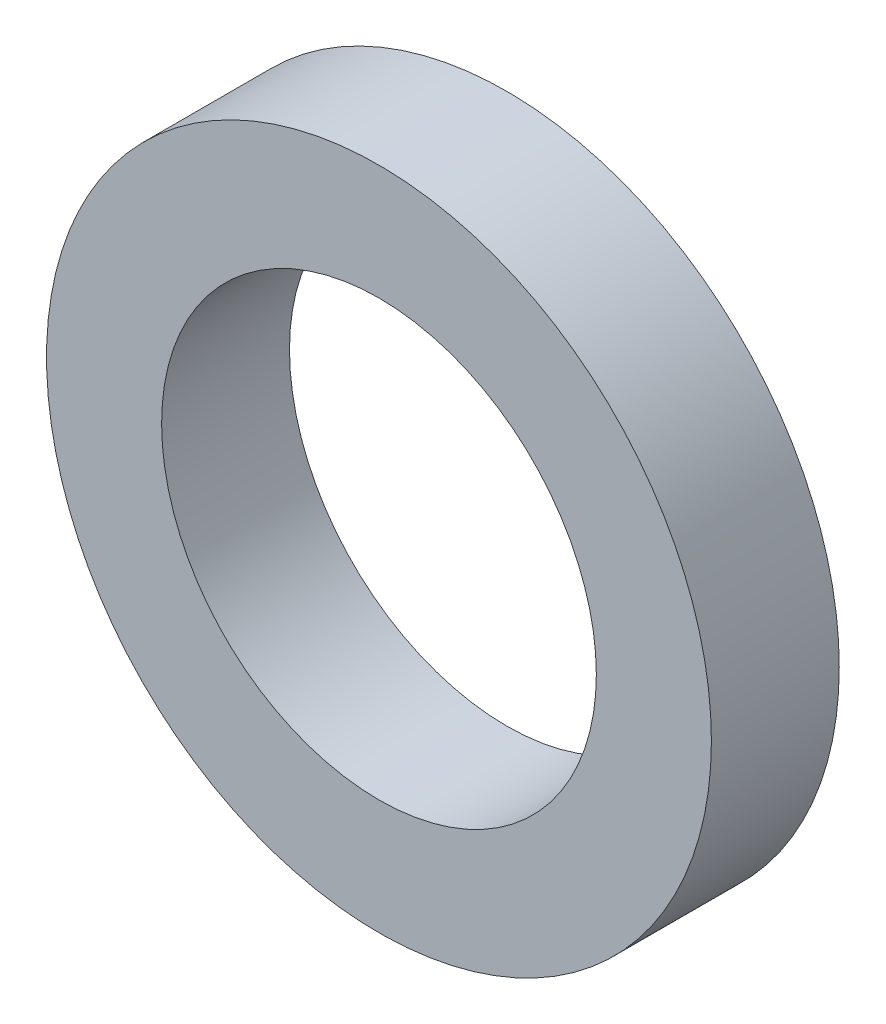
ISO-10303-21;
HEADER;
FILE_DESCRIPTION(('STEP AP214'),'2;1');
FILE_NAME('part.step','',(''),(''),'','','');
FILE_SCHEMA(('AUTOMOTIVE_DESIGN { 1 0 10303 214 1 1 1 1 }'));
ENDSEC;
DATA;
#1=APPLICATION_CONTEXT('core data for automotive mechanical design processes');
#2=APPLICATION_PROTOCOL_DEFINITION('international standard','automotive_design',2000,#1);
#3=PRODUCT_CONTEXT('',#1,'mechanical');
#4=PRODUCT('Part','Part','',(#3));
#5=PRODUCT_RELATED_PRODUCT_CATEGORY('part','',(#4));
#6=PRODUCT_DEFINITION_FORMATION('','',#4);
#7=PRODUCT_DEFINITION_CONTEXT('part definition',#1,'design');
#8=PRODUCT_DEFINITION('design','',#6,#7);
#9=PRODUCT_DEFINITION_SHAPE('','',#8);
#10=(LENGTH_UNIT() NAMED_UNIT(*) SI_UNIT(.MILLI.,.METRE.));
#11=(NAMED_UNIT(*) PLANE_ANGLE_UNIT() SI_UNIT($,.RADIAN.));
#12=(NAMED_UNIT(*) SI_UNIT($,.STERADIAN.) SOLID_ANGLE_UNIT());
#13=UNCERTAINTY_MEASURE_WITH_UNIT(LENGTH_MEASURE(1.E-05),#10,'distance_accuracy_value','');
#14=(GEOMETRIC_REPRESENTATION_CONTEXT(3) GLOBAL_UNCERTAINTY_ASSIGNED_CONTEXT((#13)) GLOBAL_UNIT_ASSIGNED_CONTEXT((#10,
#11,#12)) REPRESENTATION_CONTEXT('',''));
#15=CARTESIAN_POINT('',(0.,0.,0.));
#16=DIRECTION('',(0.,0.,1.));
#17=DIRECTION('',(1.,0.,0.));
#18=AXIS2_PLACEMENT_3D('',#15,#16,#17);
#19=CARTESIAN_POINT('',(0.,0.,-10.));
#20=DIRECTION('',(0.,0.,1.));
#21=DIRECTION('',(1.,0.,0.));
#22=AXIS2_PLACEMENT_3D('',#19,#20,#21);
#23=PLANE('',#22);
#24=CARTESIAN_POINT('',(0.,0.,-10.));
#25=DIRECTION('',(0.,0.,1.));
#26=DIRECTION('',(1.,0.,0.));
#27=AXIS2_PLACEMENT_3D('',#24,#25,#26);
#28=CIRCLE('',#27,13.);
#29=CARTESIAN_POINT('',(13.,0.,-10.));
#30=VERTEX_POINT('',#29);
#31=EDGE_CURVE('E10',#30,#30,#28,.T.);
#32=ORIENTED_EDGE('',*,*,#31,.T.);
#33=EDGE_LOOP('',(#32));
#34=FACE_BOUND('',#33,.T.);
#35=CARTESIAN_POINT('',(0.,0.,-10.));
#36=DIRECTION('',(0.,0.,1.));
#37=DIRECTION('',(1.,0.,0.));
#38=AXIS2_PLACEMENT_3D('',#35,#36,#37);
#39=CIRCLE('',#38,8.5);
#40=CARTESIAN_POINT('',(8.5,0.,-10.));
#41=VERTEX_POINT('',#40);
#42=EDGE_CURVE('E46',#41,#41,#39,.T.);
#43=ORIENTED_EDGE('',*,*,#42,.F.);
#44=EDGE_LOOP('',(#43));
#45=FACE_BOUND('',#44,.T.);
#46=ADVANCED_FACE('F32',(#34,#45),#23,.T.);
#47=CARTESIAN_POINT('',(0.,0.,-15.));
#48=DIRECTION('',(0.,0.,1.));
#49=DIRECTION('',(1.,0.,0.));
#50=AXIS2_PLACEMENT_3D('',#47,#48,#49);
#51=PLANE('',#50);
#52=CARTESIAN_POINT('',(0.,0.,-15.));
#53=DIRECTION('',(0.,0.,1.));
#54=DIRECTION('',(1.,0.,0.));
#55=AXIS2_PLACEMENT_3D('',#52,#53,#54);
#56=CIRCLE('',#55,13.);
#57=CARTESIAN_POINT('',(13.,0.,-15.));
#58=VERTEX_POINT('',#57);
#59=EDGE_CURVE('E36',#58,#58,#56,.T.);
#60=ORIENTED_EDGE('',*,*,#59,.F.);
#61=EDGE_LOOP('',(#60));
#62=FACE_BOUND('',#61,.T.);
#63=CARTESIAN_POINT('',(0.,0.,-15.));
#64=DIRECTION('',(0.,0.,1.));
#65=DIRECTION('',(1.,0.,0.));
#66=AXIS2_PLACEMENT_3D('',#63,#64,#65);
#67=CIRCLE('',#66,8.5);
#68=CARTESIAN_POINT('',(8.5,0.,-15.));
#69=VERTEX_POINT('',#68);
#70=EDGE_CURVE('E48',#69,#69,#67,.T.);
#71=ORIENTED_EDGE('',*,*,#70,.T.);
#72=EDGE_LOOP('',(#71));
#73=FACE_BOUND('',#72,.T.);
#74=ADVANCED_FACE('F59',(#62,#73),#51,.F.);
#75=CARTESIAN_POINT('',(0.,0.,-10.));
#76=DIRECTION('',(0.,0.,-1.));
#77=DIRECTION('',(-1.,0.,0.));
#78=AXIS2_PLACEMENT_3D('',#75,#76,#77);
#79=CYLINDRICAL_SURFACE('',#78,13.);
#80=ORIENTED_EDGE('',*,*,#31,.F.);
#81=EDGE_LOOP('',(#80));
#82=FACE_BOUND('',#81,.T.);
#83=ORIENTED_EDGE('',*,*,#59,.T.);
#84=EDGE_LOOP('',(#83));
#85=FACE_BOUND('',#84,.T.);
#86=ADVANCED_FACE('F34',(#82,#85),#79,.T.);
#87=CARTESIAN_POINT('',(0.,0.,-10.));
#88=DIRECTION('',(0.,0.,-1.));
#89=DIRECTION('',(-1.,0.,0.));
#90=AXIS2_PLACEMENT_3D('',#87,#88,#89);
#91=CYLINDRICAL_SURFACE('',#90,8.5);
#92=ORIENTED_EDGE('',*,*,#42,.T.);
#93=EDGE_LOOP('',(#92));
#94=FACE_BOUND('',#93,.T.);
#95=ORIENTED_EDGE('',*,*,#70,.F.);
#96=EDGE_LOOP('',(#95));
#97=FACE_BOUND('',#96,.T.);
#98=ADVANCED_FACE('F55',(#94,#97),#91,.F.);
#99=CLOSED_SHELL('',(#46,#74,#86,#98));
#100=MANIFOLD_SOLID_BREP('B2',#99);
#101=ADVANCED_BREP_SHAPE_REPRESENTATION('',(#18,#100),#14);
#102=SHAPE_DEFINITION_REPRESENTATION(#9,#101);
ENDSEC;
END-ISO-10303-21;
